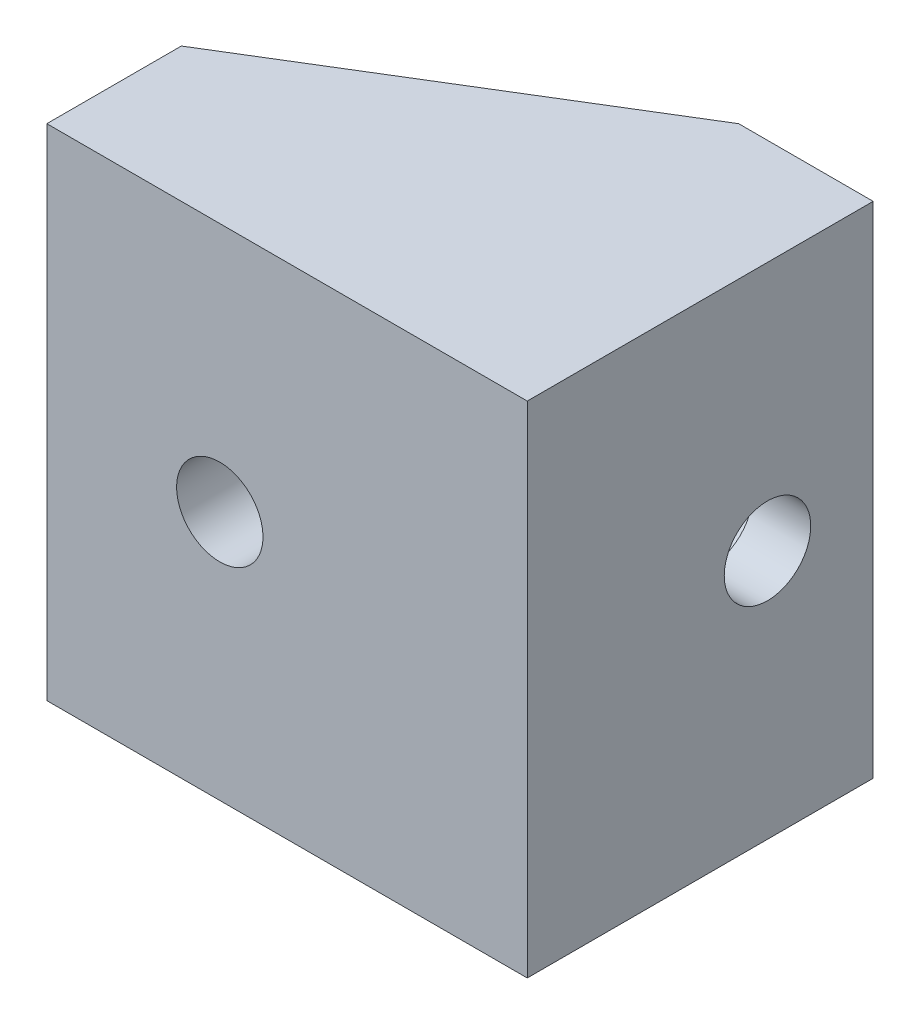
ISO-10303-21;
HEADER;
FILE_DESCRIPTION(('STEP AP214'),'2;1');
FILE_NAME('part.step','',(''),(''),'','','');
FILE_SCHEMA(('AUTOMOTIVE_DESIGN { 1 0 10303 214 1 1 1 1 }'));
ENDSEC;
DATA;
#1=APPLICATION_CONTEXT('core data for automotive mechanical design processes');
#2=APPLICATION_PROTOCOL_DEFINITION('international standard','automotive_design',2000,#1);
#3=PRODUCT_CONTEXT('',#1,'mechanical');
#4=PRODUCT('Part','Part','',(#3));
#5=PRODUCT_RELATED_PRODUCT_CATEGORY('part','',(#4));
#6=PRODUCT_DEFINITION_FORMATION('','',#4);
#7=PRODUCT_DEFINITION_CONTEXT('part definition',#1,'design');
#8=PRODUCT_DEFINITION('design','',#6,#7);
#9=PRODUCT_DEFINITION_SHAPE('','',#8);
#10=(LENGTH_UNIT() NAMED_UNIT(*) SI_UNIT(.MILLI.,.METRE.));
#11=(NAMED_UNIT(*) PLANE_ANGLE_UNIT() SI_UNIT($,.RADIAN.));
#12=(NAMED_UNIT(*) SI_UNIT($,.STERADIAN.) SOLID_ANGLE_UNIT());
#13=UNCERTAINTY_MEASURE_WITH_UNIT(LENGTH_MEASURE(1.E-05),#10,'distance_accuracy_value','');
#14=(GEOMETRIC_REPRESENTATION_CONTEXT(3) GLOBAL_UNCERTAINTY_ASSIGNED_CONTEXT((#13)) GLOBAL_UNIT_ASSIGNED_CONTEXT((#10,
#11,#12)) REPRESENTATION_CONTEXT('',''));
#15=CARTESIAN_POINT('',(0.,0.,0.));
#16=DIRECTION('',(0.,0.,1.));
#17=DIRECTION('',(1.,0.,0.));
#18=AXIS2_PLACEMENT_3D('',#15,#16,#17);
#19=CARTESIAN_POINT('',(-18.,20.,0.));
#20=DIRECTION('',(0.,0.,1.));
#21=DIRECTION('',(1.,0.,0.));
#22=AXIS2_PLACEMENT_3D('',#19,#20,#21);
#23=PLANE('',#22);
#24=CARTESIAN_POINT('',(-9.,10.,0.));
#25=DIRECTION('',(0.,0.,-1.));
#26=DIRECTION('',(-1.,0.,0.));
#27=AXIS2_PLACEMENT_3D('',#24,#25,#26);
#28=CIRCLE('',#27,5.08);
#29=CARTESIAN_POINT('',(-14.08,10.,0.));
#30=VERTEX_POINT('',#29);
#31=EDGE_CURVE('E151',#30,#30,#28,.T.);
#32=ORIENTED_EDGE('',*,*,#31,.F.);
#33=EDGE_LOOP('',(#32));
#34=FACE_BOUND('',#33,.T.);
#35=DIRECTION('',(-1.,0.,0.));
#36=VECTOR('',#35,1.);
#37=CARTESIAN_POINT('',(-18.,0.,0.));
#38=LINE('',#37,#36);
#39=CARTESIAN_POINT('',(0.,0.,0.));
#40=VERTEX_POINT('',#39);
#41=CARTESIAN_POINT('',(-18.,0.,0.));
#42=VERTEX_POINT('',#41);
#43=EDGE_CURVE('E172',#40,#42,#38,.T.);
#44=ORIENTED_EDGE('',*,*,#43,.T.);
#45=DIRECTION('',(0.,-1.,0.));
#46=VECTOR('',#45,1.);
#47=CARTESIAN_POINT('',(-18.,20.,0.));
#48=LINE('',#47,#46);
#49=CARTESIAN_POINT('',(-18.,20.,0.));
#50=VERTEX_POINT('',#49);
#51=EDGE_CURVE('E11',#50,#42,#48,.T.);
#52=ORIENTED_EDGE('',*,*,#51,.F.);
#53=DIRECTION('',(-1.,0.,0.));
#54=VECTOR('',#53,1.);
#55=CARTESIAN_POINT('',(-18.,20.,0.));
#56=LINE('',#55,#54);
#57=CARTESIAN_POINT('',(0.,20.,0.));
#58=VERTEX_POINT('',#57);
#59=EDGE_CURVE('E173',#58,#50,#56,.T.);
#60=ORIENTED_EDGE('',*,*,#59,.F.);
#61=DIRECTION('',(0.,-1.,0.));
#62=VECTOR('',#61,1.);
#63=CARTESIAN_POINT('',(0.,20.,0.));
#64=LINE('',#63,#62);
#65=EDGE_CURVE('E180',#58,#40,#64,.T.);
#66=ORIENTED_EDGE('',*,*,#65,.T.);
#67=EDGE_LOOP('',(#44,#52,#60,#66));
#68=FACE_BOUND('',#67,.T.);
#69=ADVANCED_FACE('F39',(#34,#68),#23,.F.);
#70=CARTESIAN_POINT('',(-18.,20.,7.));
#71=DIRECTION('',(1.,0.,0.));
#72=DIRECTION('',(0.,0.,-1.));
#73=AXIS2_PLACEMENT_3D('',#70,#71,#72);
#74=PLANE('',#73);
#75=ORIENTED_EDGE('',*,*,#51,.T.);
#76=DIRECTION('',(0.,1.,0.));
#77=VECTOR('',#76,1.);
#78=CARTESIAN_POINT('',(-18.,-3.,0.));
#79=LINE('',#78,#77);
#80=CARTESIAN_POINT('',(-18.,-3.,0.));
#81=VERTEX_POINT('',#80);
#82=EDGE_CURVE('E148',#81,#42,#79,.T.);
#83=ORIENTED_EDGE('',*,*,#82,.F.);
#84=DIRECTION('',(0.,0.,-1.));
#85=VECTOR('',#84,1.);
#86=CARTESIAN_POINT('',(-18.,-3.,0.));
#87=LINE('',#86,#85);
#88=CARTESIAN_POINT('',(-18.,-3.,7.));
#89=VERTEX_POINT('',#88);
#90=EDGE_CURVE('E128',#89,#81,#87,.T.);
#91=ORIENTED_EDGE('',*,*,#90,.F.);
#92=DIRECTION('',(0.,-1.,0.));
#93=VECTOR('',#92,1.);
#94=CARTESIAN_POINT('',(-18.,20.,7.));
#95=LINE('',#94,#93);
#96=CARTESIAN_POINT('',(-18.,23.,7.));
#97=VERTEX_POINT('',#96);
#98=EDGE_CURVE('E47',#97,#89,#95,.T.);
#99=ORIENTED_EDGE('',*,*,#98,.F.);
#100=DIRECTION('',(0.,0.,1.));
#101=VECTOR('',#100,1.);
#102=CARTESIAN_POINT('',(-18.,23.,0.));
#103=LINE('',#102,#101);
#104=CARTESIAN_POINT('',(-18.,23.,0.));
#105=VERTEX_POINT('',#104);
#106=EDGE_CURVE('E100',#105,#97,#103,.T.);
#107=ORIENTED_EDGE('',*,*,#106,.F.);
#108=DIRECTION('',(0.,-1.,0.));
#109=VECTOR('',#108,1.);
#110=CARTESIAN_POINT('',(-18.,23.,0.));
#111=LINE('',#110,#109);
#112=EDGE_CURVE('E104',#105,#50,#111,.T.);
#113=ORIENTED_EDGE('',*,*,#112,.T.);
#114=EDGE_LOOP('',(#75,#83,#91,#99,#107,#113));
#115=FACE_BOUND('',#114,.T.);
#116=ADVANCED_FACE('F102',(#115),#74,.F.);
#117=CARTESIAN_POINT('',(7.00000000000001,20.,7.));
#118=DIRECTION('',(0.,0.,-1.));
#119=DIRECTION('',(-1.,0.,0.));
#120=AXIS2_PLACEMENT_3D('',#117,#118,#119);
#121=PLANE('',#120);
#122=CARTESIAN_POINT('',(-9.,10.,7.));
#123=DIRECTION('',(0.,0.,-1.));
#124=DIRECTION('',(-1.,0.,0.));
#125=AXIS2_PLACEMENT_3D('',#122,#123,#124);
#126=CIRCLE('',#125,2.2479);
#127=CARTESIAN_POINT('',(-11.2479,10.,7.));
#128=VERTEX_POINT('',#127);
#129=EDGE_CURVE('E157',#128,#128,#126,.T.);
#130=ORIENTED_EDGE('',*,*,#129,.T.);
#131=EDGE_LOOP('',(#130));
#132=FACE_BOUND('',#131,.T.);
#133=ORIENTED_EDGE('',*,*,#98,.T.);
#134=DIRECTION('',(-1.,0.,0.));
#135=VECTOR('',#134,1.);
#136=CARTESIAN_POINT('',(-18.,-3.,7.));
#137=LINE('',#136,#135);
#138=CARTESIAN_POINT('',(7.00000000000001,-3.,7.));
#139=VERTEX_POINT('',#138);
#140=EDGE_CURVE('E143',#139,#89,#137,.T.);
#141=ORIENTED_EDGE('',*,*,#140,.F.);
#142=DIRECTION('',(0.,-1.,0.));
#143=VECTOR('',#142,1.);
#144=CARTESIAN_POINT('',(7.00000000000001,20.,7.));
#145=LINE('',#144,#143);
#146=CARTESIAN_POINT('',(7.00000000000001,23.,7.));
#147=VERTEX_POINT('',#146);
#148=EDGE_CURVE('E190',#147,#139,#145,.T.);
#149=ORIENTED_EDGE('',*,*,#148,.F.);
#150=DIRECTION('',(1.,0.,0.));
#151=VECTOR('',#150,1.);
#152=CARTESIAN_POINT('',(0.,23.,7.));
#153=LINE('',#152,#151);
#154=EDGE_CURVE('E110',#97,#147,#153,.T.);
#155=ORIENTED_EDGE('',*,*,#154,.F.);
#156=EDGE_LOOP('',(#133,#141,#149,#155));
#157=FACE_BOUND('',#156,.T.);
#158=ADVANCED_FACE('F193',(#132,#157),#121,.F.);
#159=CARTESIAN_POINT('',(7.,20.,-11.));
#160=DIRECTION('',(-1.,0.,0.));
#161=DIRECTION('',(0.,0.,1.));
#162=AXIS2_PLACEMENT_3D('',#159,#160,#161);
#163=PLANE('',#162);
#164=CARTESIAN_POINT('',(7.00000000000001,10.,-5.5));
#165=DIRECTION('',(-1.,0.,0.));
#166=DIRECTION('',(0.,0.,1.));
#167=AXIS2_PLACEMENT_3D('',#164,#165,#166);
#168=CIRCLE('',#167,2.25);
#169=CARTESIAN_POINT('',(7.00000000000001,10.,-3.25));
#170=VERTEX_POINT('',#169);
#171=EDGE_CURVE('E169',#170,#170,#168,.T.);
#172=ORIENTED_EDGE('',*,*,#171,.T.);
#173=EDGE_LOOP('',(#172));
#174=FACE_BOUND('',#173,.T.);
#175=ORIENTED_EDGE('',*,*,#148,.T.);
#176=DIRECTION('',(0.,0.,1.));
#177=VECTOR('',#176,1.);
#178=CARTESIAN_POINT('',(7.00000000000001,-3.,7.));
#179=LINE('',#178,#177);
#180=CARTESIAN_POINT('',(7.,-3.,-11.));
#181=VERTEX_POINT('',#180);
#182=EDGE_CURVE('E140',#181,#139,#179,.T.);
#183=ORIENTED_EDGE('',*,*,#182,.F.);
#184=DIRECTION('',(0.,-1.,0.));
#185=VECTOR('',#184,1.);
#186=CARTESIAN_POINT('',(7.,20.,-11.));
#187=LINE('',#186,#185);
#188=CARTESIAN_POINT('',(7.,23.,-11.));
#189=VERTEX_POINT('',#188);
#190=EDGE_CURVE('E188',#189,#181,#187,.T.);
#191=ORIENTED_EDGE('',*,*,#190,.F.);
#192=DIRECTION('',(0.,0.,-1.));
#193=VECTOR('',#192,1.);
#194=CARTESIAN_POINT('',(7.00000000000001,23.,0.));
#195=LINE('',#194,#193);
#196=EDGE_CURVE('E205',#147,#189,#195,.T.);
#197=ORIENTED_EDGE('',*,*,#196,.F.);
#198=EDGE_LOOP('',(#175,#183,#191,#197));
#199=FACE_BOUND('',#198,.T.);
#200=ADVANCED_FACE('F203',(#174,#199),#163,.F.);
#201=CARTESIAN_POINT('',(0.,20.,-11.));
#202=DIRECTION('',(0.,0.,1.));
#203=DIRECTION('',(1.,0.,0.));
#204=AXIS2_PLACEMENT_3D('',#201,#202,#203);
#205=PLANE('',#204);
#206=ORIENTED_EDGE('',*,*,#190,.T.);
#207=DIRECTION('',(1.,0.,0.));
#208=VECTOR('',#207,1.);
#209=CARTESIAN_POINT('',(7.,-3.,-11.));
#210=LINE('',#209,#208);
#211=CARTESIAN_POINT('',(0.,-3.,-11.));
#212=VERTEX_POINT('',#211);
#213=EDGE_CURVE('E137',#212,#181,#210,.T.);
#214=ORIENTED_EDGE('',*,*,#213,.F.);
#215=DIRECTION('',(0.,1.,0.));
#216=VECTOR('',#215,1.);
#217=CARTESIAN_POINT('',(0.,-3.,-11.));
#218=LINE('',#217,#216);
#219=CARTESIAN_POINT('',(0.,0.,-11.));
#220=VERTEX_POINT('',#219);
#221=EDGE_CURVE('E145',#212,#220,#218,.T.);
#222=ORIENTED_EDGE('',*,*,#221,.T.);
#223=DIRECTION('',(0.,-1.,0.));
#224=VECTOR('',#223,1.);
#225=CARTESIAN_POINT('',(0.,20.,-11.));
#226=LINE('',#225,#224);
#227=CARTESIAN_POINT('',(0.,20.,-11.));
#228=VERTEX_POINT('',#227);
#229=EDGE_CURVE('E54',#228,#220,#226,.T.);
#230=ORIENTED_EDGE('',*,*,#229,.F.);
#231=DIRECTION('',(0.,-1.,0.));
#232=VECTOR('',#231,1.);
#233=CARTESIAN_POINT('',(0.,23.,-11.));
#234=LINE('',#233,#232);
#235=CARTESIAN_POINT('',(0.,23.,-11.));
#236=VERTEX_POINT('',#235);
#237=EDGE_CURVE('E125',#236,#228,#234,.T.);
#238=ORIENTED_EDGE('',*,*,#237,.F.);
#239=DIRECTION('',(-1.,0.,0.));
#240=VECTOR('',#239,1.);
#241=CARTESIAN_POINT('',(0.,23.,-11.));
#242=LINE('',#241,#240);
#243=EDGE_CURVE('E117',#189,#236,#242,.T.);
#244=ORIENTED_EDGE('',*,*,#243,.F.);
#245=EDGE_LOOP('',(#206,#214,#222,#230,#238,#244));
#246=FACE_BOUND('',#245,.T.);
#247=ADVANCED_FACE('F209',(#246),#205,.F.);
#248=CARTESIAN_POINT('',(0.,20.,0.));
#249=DIRECTION('',(1.,0.,0.));
#250=DIRECTION('',(0.,0.,-1.));
#251=AXIS2_PLACEMENT_3D('',#248,#249,#250);
#252=PLANE('',#251);
#253=CARTESIAN_POINT('',(0.,10.,-5.5));
#254=DIRECTION('',(-1.,0.,0.));
#255=DIRECTION('',(0.,0.,1.));
#256=AXIS2_PLACEMENT_3D('',#253,#254,#255);
#257=CIRCLE('',#256,4.);
#258=CARTESIAN_POINT('',(0.,10.,-1.5));
#259=VERTEX_POINT('',#258);
#260=EDGE_CURVE('E160',#259,#259,#257,.T.);
#261=ORIENTED_EDGE('',*,*,#260,.F.);
#262=EDGE_LOOP('',(#261));
#263=FACE_BOUND('',#262,.T.);
#264=DIRECTION('',(0.,0.,1.));
#265=VECTOR('',#264,1.);
#266=CARTESIAN_POINT('',(0.,0.,0.));
#267=LINE('',#266,#265);
#268=EDGE_CURVE('E177',#220,#40,#267,.T.);
#269=ORIENTED_EDGE('',*,*,#268,.T.);
#270=ORIENTED_EDGE('',*,*,#65,.F.);
#271=DIRECTION('',(0.,0.,1.));
#272=VECTOR('',#271,1.);
#273=CARTESIAN_POINT('',(0.,20.,0.));
#274=LINE('',#273,#272);
#275=EDGE_CURVE('E176',#228,#58,#274,.T.);
#276=ORIENTED_EDGE('',*,*,#275,.F.);
#277=ORIENTED_EDGE('',*,*,#229,.T.);
#278=EDGE_LOOP('',(#269,#270,#276,#277));
#279=FACE_BOUND('',#278,.T.);
#280=ADVANCED_FACE('F215',(#263,#279),#252,.F.);
#281=CARTESIAN_POINT('',(0.,10.,-5.5));
#282=DIRECTION('',(-1.,0.,0.));
#283=DIRECTION('',(0.,0.,1.));
#284=AXIS2_PLACEMENT_3D('',#281,#282,#283);
#285=CYLINDRICAL_SURFACE('',#284,2.25);
#286=ORIENTED_EDGE('',*,*,#171,.F.);
#287=EDGE_LOOP('',(#286));
#288=FACE_BOUND('',#287,.T.);
#289=CARTESIAN_POINT('',(4.,10.,-5.5));
#290=DIRECTION('',(-1.,0.,0.));
#291=DIRECTION('',(0.,0.,1.));
#292=AXIS2_PLACEMENT_3D('',#289,#290,#291);
#293=CIRCLE('',#292,2.25);
#294=CARTESIAN_POINT('',(4.,10.,-3.25));
#295=VERTEX_POINT('',#294);
#296=EDGE_CURVE('E166',#295,#295,#293,.T.);
#297=ORIENTED_EDGE('',*,*,#296,.T.);
#298=EDGE_LOOP('',(#297));
#299=FACE_BOUND('',#298,.T.);
#300=ADVANCED_FACE('F252',(#288,#299),#285,.F.);
#301=CARTESIAN_POINT('',(4.,12.25,-5.5));
#302=DIRECTION('',(1.,0.,0.));
#303=DIRECTION('',(0.,0.,-1.));
#304=AXIS2_PLACEMENT_3D('',#301,#302,#303);
#305=PLANE('',#304);
#306=ORIENTED_EDGE('',*,*,#296,.F.);
#307=EDGE_LOOP('',(#306));
#308=FACE_BOUND('',#307,.T.);
#309=CARTESIAN_POINT('',(4.,10.,-5.5));
#310=DIRECTION('',(-1.,0.,0.));
#311=DIRECTION('',(0.,0.,1.));
#312=AXIS2_PLACEMENT_3D('',#309,#310,#311);
#313=CIRCLE('',#312,4.);
#314=CARTESIAN_POINT('',(4.,10.,-1.5));
#315=VERTEX_POINT('',#314);
#316=EDGE_CURVE('E163',#315,#315,#313,.T.);
#317=ORIENTED_EDGE('',*,*,#316,.T.);
#318=EDGE_LOOP('',(#317));
#319=FACE_BOUND('',#318,.T.);
#320=ADVANCED_FACE('F256',(#308,#319),#305,.F.);
#321=CARTESIAN_POINT('',(0.,10.,-5.5));
#322=DIRECTION('',(-1.,0.,0.));
#323=DIRECTION('',(0.,0.,1.));
#324=AXIS2_PLACEMENT_3D('',#321,#322,#323);
#325=CYLINDRICAL_SURFACE('',#324,4.);
#326=ORIENTED_EDGE('',*,*,#316,.F.);
#327=EDGE_LOOP('',(#326));
#328=FACE_BOUND('',#327,.T.);
#329=ORIENTED_EDGE('',*,*,#260,.T.);
#330=EDGE_LOOP('',(#329));
#331=FACE_BOUND('',#330,.T.);
#332=ADVANCED_FACE('F260',(#328,#331),#325,.F.);
#333=CARTESIAN_POINT('',(-9.,10.,0.));
#334=DIRECTION('',(0.,0.,-1.));
#335=DIRECTION('',(-1.,0.,0.));
#336=AXIS2_PLACEMENT_3D('',#333,#334,#335);
#337=CYLINDRICAL_SURFACE('',#336,2.2479);
#338=ORIENTED_EDGE('',*,*,#129,.F.);
#339=EDGE_LOOP('',(#338));
#340=FACE_BOUND('',#339,.T.);
#341=CARTESIAN_POINT('',(-9.,10.,3.25795836609062));
#342=DIRECTION('',(0.,0.,-1.));
#343=DIRECTION('',(-1.,0.,0.));
#344=AXIS2_PLACEMENT_3D('',#341,#342,#343);
#345=CIRCLE('',#344,2.2479);
#346=CARTESIAN_POINT('',(-11.2479,10.,3.25795836609062));
#347=VERTEX_POINT('',#346);
#348=EDGE_CURVE('E154',#347,#347,#345,.T.);
#349=ORIENTED_EDGE('',*,*,#348,.T.);
#350=EDGE_LOOP('',(#349));
#351=FACE_BOUND('',#350,.T.);
#352=ADVANCED_FACE('F227',(#340,#351),#337,.F.);
#353=CARTESIAN_POINT('',(-9.,10.,0.));
#354=DIRECTION('',(0.,0.,-1.));
#355=DIRECTION('',(-1.,0.,0.));
#356=AXIS2_PLACEMENT_3D('',#353,#354,#355);
#357=CONICAL_SURFACE('',#356,5.08,0.715584993317675);
#358=ORIENTED_EDGE('',*,*,#348,.F.);
#359=EDGE_LOOP('',(#358));
#360=FACE_BOUND('',#359,.T.);
#361=ORIENTED_EDGE('',*,*,#31,.T.);
#362=EDGE_LOOP('',(#361));
#363=FACE_BOUND('',#362,.T.);
#364=ADVANCED_FACE('F220',(#360,#363),#357,.F.);
#365=CARTESIAN_POINT('',(0.,0.,0.));
#366=DIRECTION('',(0.,1.,0.));
#367=DIRECTION('',(0.,0.,1.));
#368=AXIS2_PLACEMENT_3D('',#365,#366,#367);
#369=PLANE('',#368);
#370=ORIENTED_EDGE('',*,*,#43,.F.);
#371=ORIENTED_EDGE('',*,*,#268,.F.);
#372=DIRECTION('',(0.853281833651959,0.,-0.521450009453975));
#373=VECTOR('',#372,1.);
#374=CARTESIAN_POINT('',(0.,0.,-11.));
#375=LINE('',#374,#373);
#376=EDGE_CURVE('E124',#42,#220,#375,.T.);
#377=ORIENTED_EDGE('',*,*,#376,.F.);
#378=EDGE_LOOP('',(#370,#371,#377));
#379=FACE_BOUND('',#378,.T.);
#380=ADVANCED_FACE('F218',(#379),#369,.T.);
#381=CARTESIAN_POINT('',(0.,-3.,-11.));
#382=DIRECTION('',(0.521450009453975,0.,0.853281833651959));
#383=DIRECTION('',(0.853281833651959,0.,-0.521450009453975));
#384=AXIS2_PLACEMENT_3D('',#381,#382,#383);
#385=PLANE('',#384);
#386=ORIENTED_EDGE('',*,*,#376,.T.);
#387=ORIENTED_EDGE('',*,*,#221,.F.);
#388=DIRECTION('',(0.853281833651959,0.,-0.521450009453975));
#389=VECTOR('',#388,1.);
#390=CARTESIAN_POINT('',(0.,-3.,-11.));
#391=LINE('',#390,#389);
#392=EDGE_CURVE('E135',#81,#212,#391,.T.);
#393=ORIENTED_EDGE('',*,*,#392,.F.);
#394=ORIENTED_EDGE('',*,*,#82,.T.);
#395=EDGE_LOOP('',(#386,#387,#393,#394));
#396=FACE_BOUND('',#395,.T.);
#397=ADVANCED_FACE('F199',(#396),#385,.F.);
#398=CARTESIAN_POINT('',(0.,-3.,0.));
#399=DIRECTION('',(0.,1.,0.));
#400=DIRECTION('',(0.,0.,1.));
#401=AXIS2_PLACEMENT_3D('',#398,#399,#400);
#402=PLANE('',#401);
#403=ORIENTED_EDGE('',*,*,#90,.T.);
#404=ORIENTED_EDGE('',*,*,#392,.T.);
#405=ORIENTED_EDGE('',*,*,#213,.T.);
#406=ORIENTED_EDGE('',*,*,#182,.T.);
#407=ORIENTED_EDGE('',*,*,#140,.T.);
#408=EDGE_LOOP('',(#403,#404,#405,#406,#407));
#409=FACE_BOUND('',#408,.T.);
#410=ADVANCED_FACE('F195',(#409),#402,.F.);
#411=CARTESIAN_POINT('',(0.,20.,0.));
#412=DIRECTION('',(0.,1.,0.));
#413=DIRECTION('',(0.,0.,1.));
#414=AXIS2_PLACEMENT_3D('',#411,#412,#413);
#415=PLANE('',#414);
#416=ORIENTED_EDGE('',*,*,#275,.T.);
#417=ORIENTED_EDGE('',*,*,#59,.T.);
#418=DIRECTION('',(-0.853281833651959,0.,0.521450009453975));
#419=VECTOR('',#418,1.);
#420=CARTESIAN_POINT('',(-4.89438202247191,20.,-8.00898876404494));
#421=LINE('',#420,#419);
#422=EDGE_CURVE('E120',#228,#50,#421,.T.);
#423=ORIENTED_EDGE('',*,*,#422,.F.);
#424=EDGE_LOOP('',(#416,#417,#423));
#425=FACE_BOUND('',#424,.T.);
#426=ADVANCED_FACE('F211',(#425),#415,.F.);
#427=CARTESIAN_POINT('',(-4.89438202247191,23.,-8.00898876404494));
#428=DIRECTION('',(0.521450009453975,0.,0.853281833651959));
#429=DIRECTION('',(0.853281833651959,0.,-0.521450009453975));
#430=AXIS2_PLACEMENT_3D('',#427,#428,#429);
#431=PLANE('',#430);
#432=ORIENTED_EDGE('',*,*,#422,.T.);
#433=ORIENTED_EDGE('',*,*,#112,.F.);
#434=DIRECTION('',(-0.853281833651959,0.,0.521450009453975));
#435=VECTOR('',#434,1.);
#436=CARTESIAN_POINT('',(-4.89438202247191,23.,-8.00898876404494));
#437=LINE('',#436,#435);
#438=EDGE_CURVE('E111',#236,#105,#437,.T.);
#439=ORIENTED_EDGE('',*,*,#438,.F.);
#440=ORIENTED_EDGE('',*,*,#237,.T.);
#441=EDGE_LOOP('',(#432,#433,#439,#440));
#442=FACE_BOUND('',#441,.T.);
#443=ADVANCED_FACE('F122',(#442),#431,.F.);
#444=CARTESIAN_POINT('',(0.,23.,0.));
#445=DIRECTION('',(0.,1.,0.));
#446=DIRECTION('',(0.,0.,1.));
#447=AXIS2_PLACEMENT_3D('',#444,#445,#446);
#448=PLANE('',#447);
#449=ORIENTED_EDGE('',*,*,#438,.T.);
#450=ORIENTED_EDGE('',*,*,#106,.T.);
#451=ORIENTED_EDGE('',*,*,#154,.T.);
#452=ORIENTED_EDGE('',*,*,#196,.T.);
#453=ORIENTED_EDGE('',*,*,#243,.T.);
#454=EDGE_LOOP('',(#449,#450,#451,#452,#453));
#455=FACE_BOUND('',#454,.T.);
#456=ADVANCED_FACE('F114',(#455),#448,.T.);
#457=CLOSED_SHELL('',(#69,#116,#158,#200,#247,#280,#300,#320,#332,#352,#364,#380,#397,#410,#426,
#443,#456));
#458=MANIFOLD_SOLID_BREP('B2',#457);
#459=ADVANCED_BREP_SHAPE_REPRESENTATION('',(#18,#458),#14);
#460=SHAPE_DEFINITION_REPRESENTATION(#9,#459);
ENDSEC;
END-ISO-10303-21;
